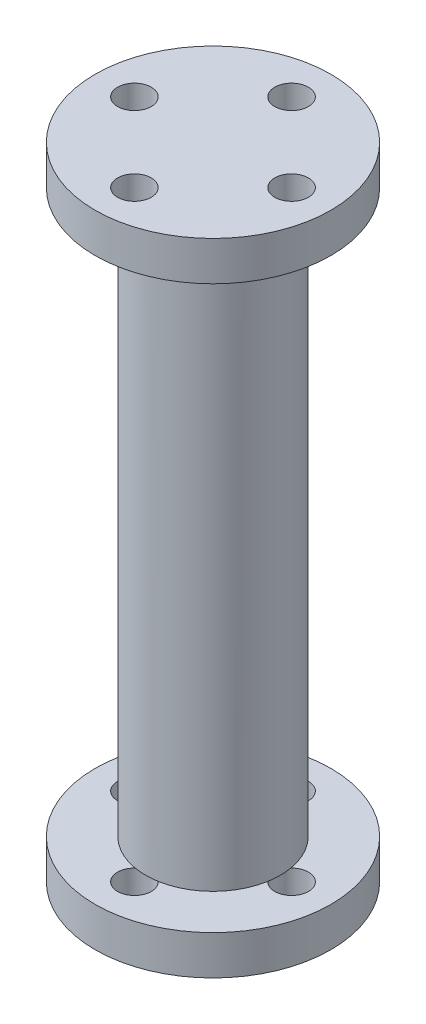
ISO-10303-21;
HEADER;
FILE_DESCRIPTION(('STEP AP214'),'2;1');
FILE_NAME('part.step','',(''),(''),'','','');
FILE_SCHEMA(('AUTOMOTIVE_DESIGN { 1 0 10303 214 1 1 1 1 }'));
ENDSEC;
DATA;
#1=APPLICATION_CONTEXT('core data for automotive mechanical design processes');
#2=APPLICATION_PROTOCOL_DEFINITION('international standard','automotive_design',2000,#1);
#3=PRODUCT_CONTEXT('',#1,'mechanical');
#4=PRODUCT('Part','Part','',(#3));
#5=PRODUCT_RELATED_PRODUCT_CATEGORY('part','',(#4));
#6=PRODUCT_DEFINITION_FORMATION('','',#4);
#7=PRODUCT_DEFINITION_CONTEXT('part definition',#1,'design');
#8=PRODUCT_DEFINITION('design','',#6,#7);
#9=PRODUCT_DEFINITION_SHAPE('','',#8);
#10=(LENGTH_UNIT() NAMED_UNIT(*) SI_UNIT(.MILLI.,.METRE.));
#11=(NAMED_UNIT(*) PLANE_ANGLE_UNIT() SI_UNIT($,.RADIAN.));
#12=(NAMED_UNIT(*) SI_UNIT($,.STERADIAN.) SOLID_ANGLE_UNIT());
#13=UNCERTAINTY_MEASURE_WITH_UNIT(LENGTH_MEASURE(1.E-05),#10,'distance_accuracy_value','');
#14=(GEOMETRIC_REPRESENTATION_CONTEXT(3) GLOBAL_UNCERTAINTY_ASSIGNED_CONTEXT((#13)) GLOBAL_UNIT_ASSIGNED_CONTEXT((#10,
#11,#12)) REPRESENTATION_CONTEXT('',''));
#15=CARTESIAN_POINT('',(0.,0.,0.));
#16=DIRECTION('',(0.,0.,1.));
#17=DIRECTION('',(1.,0.,0.));
#18=AXIS2_PLACEMENT_3D('',#15,#16,#17);
#19=CARTESIAN_POINT('',(16.6872945377766,-2.4978632583071,41.8615784724432));
#20=DIRECTION('',(0.,-1.,0.));
#21=DIRECTION('',(0.,0.,-1.));
#22=AXIS2_PLACEMENT_3D('',#19,#20,#21);
#23=CYLINDRICAL_SURFACE('',#22,10.5);
#24=CARTESIAN_POINT('',(16.6872945377766,-2.4978632583071,41.8615784724432));
#25=DIRECTION('',(0.,1.,0.));
#26=DIRECTION('',(0.,0.,1.));
#27=AXIS2_PLACEMENT_3D('',#24,#25,#26);
#28=CIRCLE('',#27,10.5);
#29=CARTESIAN_POINT('',(16.6872945377766,-2.4978632583071,31.3615784724432));
#30=VERTEX_POINT('',#29);
#31=EDGE_CURVE('E103',#30,#30,#28,.T.);
#32=CARTESIAN_POINT('',(16.6872945377766,-5.9978632583071,41.8615784724432));
#33=DIRECTION('',(0.,1.,0.));
#34=DIRECTION('',(0.,0.,1.));
#35=AXIS2_PLACEMENT_3D('',#32,#33,#34);
#36=CIRCLE('',#35,10.5);
#37=CARTESIAN_POINT('',(16.6872945377766,-5.9978632583071,31.3615784724432));
#38=VERTEX_POINT('',#37);
#39=EDGE_CURVE('E105',#38,#38,#36,.T.);
#40=CARTESIAN_POINT('',(16.6872945377766,-2.4978632583071,31.3615784724432));
#41=CARTESIAN_POINT('',(16.6872945377766,-2.53432159164043,31.3615784724432));
#42=CARTESIAN_POINT('',(16.6872945377766,-2.57077992497376,31.3615784724432));
#43=CARTESIAN_POINT('',(16.6872945377766,-2.64369659164043,31.3615784724432));
#44=CARTESIAN_POINT('',(16.6872945377766,-2.68015492497376,31.3615784724432));
#45=CARTESIAN_POINT('',(16.6872945377766,-2.75307159164043,31.3615784724432));
#46=CARTESIAN_POINT('',(16.6872945377766,-2.78952992497376,31.3615784724432));
#47=CARTESIAN_POINT('',(16.6872945377766,-2.86244659164043,31.3615784724432));
#48=CARTESIAN_POINT('',(16.6872945377766,-2.89890492497376,31.3615784724432));
#49=CARTESIAN_POINT('',(16.6872945377766,-2.97182159164043,31.3615784724432));
#50=CARTESIAN_POINT('',(16.6872945377766,-3.00827992497376,31.3615784724432));
#51=CARTESIAN_POINT('',(16.6872945377766,-3.08119659164043,31.3615784724432));
#52=CARTESIAN_POINT('',(16.6872945377766,-3.11765492497376,31.3615784724432));
#53=CARTESIAN_POINT('',(16.6872945377766,-3.19057159164043,31.3615784724432));
#54=CARTESIAN_POINT('',(16.6872945377766,-3.22702992497376,31.3615784724432));
#55=CARTESIAN_POINT('',(16.6872945377766,-3.29994659164043,31.3615784724432));
#56=CARTESIAN_POINT('',(16.6872945377766,-3.33640492497376,31.3615784724432));
#57=CARTESIAN_POINT('',(16.6872945377766,-3.40932159164043,31.3615784724432));
#58=CARTESIAN_POINT('',(16.6872945377766,-3.44577992497376,31.3615784724432));
#59=CARTESIAN_POINT('',(16.6872945377766,-3.51869659164043,31.3615784724432));
#60=CARTESIAN_POINT('',(16.6872945377766,-3.55515492497376,31.3615784724432));
#61=CARTESIAN_POINT('',(16.6872945377766,-3.62807159164043,31.3615784724432));
#62=CARTESIAN_POINT('',(16.6872945377766,-3.66452992497376,31.3615784724432));
#63=CARTESIAN_POINT('',(16.6872945377766,-3.73744659164043,31.3615784724432));
#64=CARTESIAN_POINT('',(16.6872945377766,-3.77390492497376,31.3615784724432));
#65=CARTESIAN_POINT('',(16.6872945377766,-3.84682159164043,31.3615784724432));
#66=CARTESIAN_POINT('',(16.6872945377766,-3.88327992497376,31.3615784724432));
#67=CARTESIAN_POINT('',(16.6872945377766,-3.95619659164043,31.3615784724432));
#68=CARTESIAN_POINT('',(16.6872945377766,-3.99265492497376,31.3615784724432));
#69=CARTESIAN_POINT('',(16.6872945377766,-4.06557159164043,31.3615784724432));
#70=CARTESIAN_POINT('',(16.6872945377766,-4.10202992497376,31.3615784724432));
#71=CARTESIAN_POINT('',(16.6872945377766,-4.17494659164043,31.3615784724432));
#72=CARTESIAN_POINT('',(16.6872945377766,-4.21140492497376,31.3615784724432));
#73=CARTESIAN_POINT('',(16.6872945377766,-4.28432159164043,31.3615784724432));
#74=CARTESIAN_POINT('',(16.6872945377766,-4.32077992497376,31.3615784724432));
#75=CARTESIAN_POINT('',(16.6872945377766,-4.39369659164043,31.3615784724432));
#76=CARTESIAN_POINT('',(16.6872945377766,-4.43015492497376,31.3615784724432));
#77=CARTESIAN_POINT('',(16.6872945377766,-4.50307159164043,31.3615784724432));
#78=CARTESIAN_POINT('',(16.6872945377766,-4.53952992497376,31.3615784724432));
#79=CARTESIAN_POINT('',(16.6872945377766,-4.61244659164043,31.3615784724432));
#80=CARTESIAN_POINT('',(16.6872945377766,-4.64890492497376,31.3615784724432));
#81=CARTESIAN_POINT('',(16.6872945377766,-4.72182159164043,31.3615784724432));
#82=CARTESIAN_POINT('',(16.6872945377766,-4.75827992497376,31.3615784724432));
#83=CARTESIAN_POINT('',(16.6872945377766,-4.83119659164043,31.3615784724432));
#84=CARTESIAN_POINT('',(16.6872945377766,-4.86765492497376,31.3615784724432));
#85=CARTESIAN_POINT('',(16.6872945377766,-4.94057159164043,31.3615784724432));
#86=CARTESIAN_POINT('',(16.6872945377766,-4.97702992497376,31.3615784724432));
#87=CARTESIAN_POINT('',(16.6872945377766,-5.04994659164043,31.3615784724432));
#88=CARTESIAN_POINT('',(16.6872945377766,-5.08640492497376,31.3615784724432));
#89=CARTESIAN_POINT('',(16.6872945377766,-5.15932159164043,31.3615784724432));
#90=CARTESIAN_POINT('',(16.6872945377766,-5.19577992497376,31.3615784724432));
#91=CARTESIAN_POINT('',(16.6872945377766,-5.26869659164043,31.3615784724432));
#92=CARTESIAN_POINT('',(16.6872945377766,-5.30515492497376,31.3615784724432));
#93=CARTESIAN_POINT('',(16.6872945377766,-5.37807159164043,31.3615784724432));
#94=CARTESIAN_POINT('',(16.6872945377766,-5.41452992497376,31.3615784724432));
#95=CARTESIAN_POINT('',(16.6872945377766,-5.48744659164043,31.3615784724432));
#96=CARTESIAN_POINT('',(16.6872945377766,-5.52390492497376,31.3615784724432));
#97=CARTESIAN_POINT('',(16.6872945377766,-5.59682159164043,31.3615784724432));
#98=CARTESIAN_POINT('',(16.6872945377766,-5.63327992497376,31.3615784724432));
#99=CARTESIAN_POINT('',(16.6872945377766,-5.70619659164043,31.3615784724432));
#100=CARTESIAN_POINT('',(16.6872945377766,-5.74265492497376,31.3615784724432));
#101=CARTESIAN_POINT('',(16.6872945377766,-5.81557159164043,31.3615784724432));
#102=CARTESIAN_POINT('',(16.6872945377766,-5.85202992497376,31.3615784724432));
#103=CARTESIAN_POINT('',(16.6872945377766,-5.92494659164043,31.3615784724432));
#104=CARTESIAN_POINT('',(16.6872945377766,-5.96140492497376,31.3615784724432));
#105=CARTESIAN_POINT('',(16.6872945377766,-5.9978632583071,31.3615784724432));
#106=B_SPLINE_CURVE_WITH_KNOTS('',3,(#40,#41,#42,#43,#44,#45,#46,#47,#48,#49,#50,#51,#52,#53,
#54,#55,#56,#57,#58,#59,#60,#61,#62,#63,#64,#65,#66,#67,#68,#69,#70,#71,#72,#73,#74,#75,#76,#77,
#78,#79,#80,#81,#82,#83,#84,#85,#86,#87,#88,#89,#90,#91,#92,#93,#94,#95,#96,#97,#98,#99,#100,
#101,#102,#103,#104,#105),.UNSPECIFIED.,.F.,.F.,(4,2,2,2,2,2,2,2,2,2,2,2,2,2,2,2,2,2,2,2,2,2,2,
2,2,2,2,2,2,2,2,2,4),(0.,0.109375,0.21875,0.328125,0.4375,0.546875,0.65625,0.765625,0.875,
0.984375,1.09375,1.203125,1.3125,1.421875,1.53125,1.640625,1.75,1.859375,1.96875,2.078125,
2.1875,2.296875,2.40625,2.515625,2.625,2.734375,2.84375,2.953125,3.0625,3.171875,3.28125,
3.390625,3.5),.UNSPECIFIED.);
#107=EDGE_CURVE('BSEAM38',#30,#38,#106,.T.);
#108=ORIENTED_EDGE('',*,*,#31,.F.);
#109=ORIENTED_EDGE('',*,*,#39,.T.);
#110=ORIENTED_EDGE('',*,*,#107,.T.);
#111=ORIENTED_EDGE('',*,*,#107,.F.);
#112=EDGE_LOOP('',(#108,#110,#109,#111));
#113=FACE_BOUND('',#112,.T.);
#114=ADVANCED_FACE('F38',(#113),#23,.T.);
#115=CARTESIAN_POINT('',(16.6872945377766,-2.4978632583071,41.8615784724432));
#116=DIRECTION('',(0.,1.,0.));
#117=DIRECTION('',(0.,0.,1.));
#118=AXIS2_PLACEMENT_3D('',#115,#116,#117);
#119=PLANE('',#118);
#120=CARTESIAN_POINT('',(16.6872945377766,-2.4978632583071,41.8615784724432));
#121=DIRECTION('',(0.,1.,0.));
#122=DIRECTION('',(0.,0.,1.));
#123=AXIS2_PLACEMENT_3D('',#120,#121,#122);
#124=CIRCLE('',#123,6.);
#125=CARTESIAN_POINT('',(17.7185348747761,-2.4978632583071,47.7722927581573));
#126=VERTEX_POINT('',#125);
#127=CARTESIAN_POINT('',(22.5980088234909,-2.4978632583071,42.8928188094417));
#128=VERTEX_POINT('',#127);
#129=EDGE_CURVE('E92',#126,#128,#124,.T.);
#130=ORIENTED_EDGE('',*,*,#129,.F.);
#131=CARTESIAN_POINT('',(16.687294537777,-2.4978632583071,48.8615784724432));
#132=DIRECTION('',(0.,1.,0.));
#133=DIRECTION('',(0.,0.,1.));
#134=AXIS2_PLACEMENT_3D('',#131,#132,#133);
#135=CIRCLE('',#134,1.50000000000043);
#136=CARTESIAN_POINT('',(15.6560542007777,-2.4978632583071,47.7722927581574));
#137=VERTEX_POINT('',#136);
#138=EDGE_CURVE('E83',#137,#126,#135,.T.);
#139=ORIENTED_EDGE('',*,*,#138,.F.);
#140=CARTESIAN_POINT('',(10.7765802520624,-2.4978632583071,42.8928188094426));
#141=VERTEX_POINT('',#140);
#142=EDGE_CURVE('E60',#141,#137,#124,.T.);
#143=ORIENTED_EDGE('',*,*,#142,.F.);
#144=CARTESIAN_POINT('',(9.68729453777677,-2.4978632583071,41.8615784724434));
#145=DIRECTION('',(0.,1.,0.));
#146=DIRECTION('',(0.,0.,1.));
#147=AXIS2_PLACEMENT_3D('',#144,#145,#146);
#148=CIRCLE('',#147,1.50000000000032);
#149=CARTESIAN_POINT('',(10.7765802520624,-2.4978632583071,40.8303381354441));
#150=VERTEX_POINT('',#149);
#151=EDGE_CURVE('E55',#150,#141,#148,.T.);
#152=ORIENTED_EDGE('',*,*,#151,.F.);
#153=CARTESIAN_POINT('',(15.6560542007779,-2.4978632583071,35.9508641867289));
#154=VERTEX_POINT('',#153);
#155=EDGE_CURVE('E46',#154,#150,#124,.T.);
#156=ORIENTED_EDGE('',*,*,#155,.F.);
#157=CARTESIAN_POINT('',(16.6872945377766,-2.4978632583071,34.8615784724432));
#158=DIRECTION('',(0.,1.,0.));
#159=DIRECTION('',(0.,0.,1.));
#160=AXIS2_PLACEMENT_3D('',#157,#158,#159);
#161=CIRCLE('',#160,1.5);
#162=CARTESIAN_POINT('',(17.7185348747752,-2.4978632583071,35.9508641867289));
#163=VERTEX_POINT('',#162);
#164=EDGE_CURVE('E124',#163,#154,#161,.T.);
#165=ORIENTED_EDGE('',*,*,#164,.F.);
#166=CARTESIAN_POINT('',(22.5980088234908,-2.4978632583071,40.8303381354444));
#167=VERTEX_POINT('',#166);
#168=EDGE_CURVE('E11',#167,#163,#124,.T.);
#169=ORIENTED_EDGE('',*,*,#168,.F.);
#170=CARTESIAN_POINT('',(23.6872945377768,-2.4978632583071,41.861578472443));
#171=DIRECTION('',(0.,1.,0.));
#172=DIRECTION('',(0.,0.,1.));
#173=AXIS2_PLACEMENT_3D('',#170,#171,#172);
#174=CIRCLE('',#173,1.50000000000015);
#175=EDGE_CURVE('E87',#128,#167,#174,.T.);
#176=ORIENTED_EDGE('',*,*,#175,.F.);
#177=EDGE_LOOP('',(#130,#139,#143,#152,#156,#165,#169,#176));
#178=FACE_BOUND('',#177,.T.);
#179=ORIENTED_EDGE('',*,*,#31,.T.);
#180=EDGE_LOOP('',(#179));
#181=FACE_BOUND('',#180,.T.);
#182=ADVANCED_FACE('F89',(#178,#181),#119,.T.);
#183=CARTESIAN_POINT('',(16.6872945377766,-5.9978632583071,41.8615784724432));
#184=DIRECTION('',(0.,1.,0.));
#185=DIRECTION('',(0.,0.,1.));
#186=AXIS2_PLACEMENT_3D('',#183,#184,#185);
#187=PLANE('',#186);
#188=CARTESIAN_POINT('',(16.6872945377766,-5.9978632583071,34.8615784724432));
#189=DIRECTION('',(0.,1.,0.));
#190=DIRECTION('',(0.,0.,1.));
#191=AXIS2_PLACEMENT_3D('',#188,#189,#190);
#192=CIRCLE('',#191,1.5);
#193=CARTESIAN_POINT('',(16.6872945377766,-5.9978632583071,36.3615784724432));
#194=VERTEX_POINT('',#193);
#195=EDGE_CURVE('E41',#194,#194,#192,.T.);
#196=ORIENTED_EDGE('',*,*,#195,.T.);
#197=EDGE_LOOP('',(#196));
#198=FACE_BOUND('',#197,.T.);
#199=CARTESIAN_POINT('',(23.6872945377768,-5.9978632583071,41.861578472443));
#200=DIRECTION('',(0.,1.,0.));
#201=DIRECTION('',(0.,0.,1.));
#202=AXIS2_PLACEMENT_3D('',#199,#200,#201);
#203=CIRCLE('',#202,1.50000000000015);
#204=CARTESIAN_POINT('',(23.6872945377768,-5.9978632583071,43.3615784724431));
#205=VERTEX_POINT('',#204);
#206=EDGE_CURVE('E138',#205,#205,#203,.T.);
#207=ORIENTED_EDGE('',*,*,#206,.T.);
#208=EDGE_LOOP('',(#207));
#209=FACE_BOUND('',#208,.T.);
#210=CARTESIAN_POINT('',(16.687294537777,-5.9978632583071,48.8615784724432));
#211=DIRECTION('',(0.,1.,0.));
#212=DIRECTION('',(0.,0.,1.));
#213=AXIS2_PLACEMENT_3D('',#210,#211,#212);
#214=CIRCLE('',#213,1.50000000000043);
#215=CARTESIAN_POINT('',(16.687294537777,-5.9978632583071,50.3615784724436));
#216=VERTEX_POINT('',#215);
#217=EDGE_CURVE('E136',#216,#216,#214,.T.);
#218=ORIENTED_EDGE('',*,*,#217,.T.);
#219=EDGE_LOOP('',(#218));
#220=FACE_BOUND('',#219,.T.);
#221=CARTESIAN_POINT('',(9.68729453777677,-5.9978632583071,41.8615784724434));
#222=DIRECTION('',(0.,1.,0.));
#223=DIRECTION('',(0.,0.,1.));
#224=AXIS2_PLACEMENT_3D('',#221,#222,#223);
#225=CIRCLE('',#224,1.50000000000032);
#226=CARTESIAN_POINT('',(9.68729453777677,-5.9978632583071,43.3615784724437));
#227=VERTEX_POINT('',#226);
#228=EDGE_CURVE('E127',#227,#227,#225,.T.);
#229=ORIENTED_EDGE('',*,*,#228,.T.);
#230=EDGE_LOOP('',(#229));
#231=FACE_BOUND('',#230,.T.);
#232=ORIENTED_EDGE('',*,*,#39,.F.);
#233=EDGE_LOOP('',(#232));
#234=FACE_BOUND('',#233,.T.);
#235=ADVANCED_FACE('F145',(#198,#209,#220,#231,#234),#187,.F.);
#236=CARTESIAN_POINT('',(9.68729453777677,-12.6978632583071,41.8615784724434));
#237=DIRECTION('',(0.,1.,0.));
#238=DIRECTION('',(0.,0.,1.));
#239=AXIS2_PLACEMENT_3D('',#236,#237,#238);
#240=CYLINDRICAL_SURFACE('',#239,1.50000000000032);
#241=EDGE_CURVE('E93',#141,#150,#148,.T.);
#242=ORIENTED_EDGE('',*,*,#241,.T.);
#243=ORIENTED_EDGE('',*,*,#151,.T.);
#244=EDGE_LOOP('',(#242,#243));
#245=FACE_BOUND('',#244,.T.);
#246=ORIENTED_EDGE('',*,*,#228,.F.);
#247=EDGE_LOOP('',(#246));
#248=FACE_BOUND('',#247,.T.);
#249=ADVANCED_FACE('F175',(#245,#248),#240,.F.);
#250=CARTESIAN_POINT('',(16.687294537777,-12.6978632583071,48.8615784724432));
#251=DIRECTION('',(0.,1.,0.));
#252=DIRECTION('',(0.,0.,1.));
#253=AXIS2_PLACEMENT_3D('',#250,#251,#252);
#254=CYLINDRICAL_SURFACE('',#253,1.50000000000043);
#255=EDGE_CURVE('E80',#126,#137,#135,.T.);
#256=ORIENTED_EDGE('',*,*,#255,.T.);
#257=ORIENTED_EDGE('',*,*,#138,.T.);
#258=EDGE_LOOP('',(#256,#257));
#259=FACE_BOUND('',#258,.T.);
#260=ORIENTED_EDGE('',*,*,#217,.F.);
#261=EDGE_LOOP('',(#260));
#262=FACE_BOUND('',#261,.T.);
#263=ADVANCED_FACE('F81',(#259,#262),#254,.F.);
#264=CARTESIAN_POINT('',(23.6872945377768,-12.6978632583071,41.861578472443));
#265=DIRECTION('',(0.,1.,0.));
#266=DIRECTION('',(0.,0.,1.));
#267=AXIS2_PLACEMENT_3D('',#264,#265,#266);
#268=CYLINDRICAL_SURFACE('',#267,1.50000000000015);
#269=EDGE_CURVE('E125',#167,#128,#174,.T.);
#270=ORIENTED_EDGE('',*,*,#269,.T.);
#271=ORIENTED_EDGE('',*,*,#175,.T.);
#272=EDGE_LOOP('',(#270,#271));
#273=FACE_BOUND('',#272,.T.);
#274=ORIENTED_EDGE('',*,*,#206,.F.);
#275=EDGE_LOOP('',(#274));
#276=FACE_BOUND('',#275,.T.);
#277=ADVANCED_FACE('F149',(#273,#276),#268,.F.);
#278=CARTESIAN_POINT('',(16.6872945377766,-12.6978632583071,34.8615784724432));
#279=DIRECTION('',(0.,1.,0.));
#280=DIRECTION('',(0.,0.,1.));
#281=AXIS2_PLACEMENT_3D('',#278,#279,#280);
#282=CYLINDRICAL_SURFACE('',#281,1.5);
#283=ORIENTED_EDGE('',*,*,#164,.T.);
#284=EDGE_CURVE('E120',#154,#163,#161,.T.);
#285=ORIENTED_EDGE('',*,*,#284,.T.);
#286=EDGE_LOOP('',(#283,#285));
#287=FACE_BOUND('',#286,.T.);
#288=ORIENTED_EDGE('',*,*,#195,.F.);
#289=EDGE_LOOP('',(#288));
#290=FACE_BOUND('',#289,.T.);
#291=ADVANCED_FACE('F147',(#287,#290),#282,.F.);
#292=CARTESIAN_POINT('',(16.6872945377766,-2.4978632583071,41.8615784724432));
#293=DIRECTION('',(0.,1.,0.));
#294=DIRECTION('',(0.,0.,1.));
#295=AXIS2_PLACEMENT_3D('',#292,#293,#294);
#296=PLANE('',#295);
#297=ORIENTED_EDGE('',*,*,#284,.F.);
#298=EDGE_CURVE('E113',#163,#154,#124,.T.);
#299=ORIENTED_EDGE('',*,*,#298,.F.);
#300=EDGE_LOOP('',(#297,#299));
#301=FACE_BOUND('',#300,.T.);
#302=ADVANCED_FACE('F119',(#301),#296,.F.);
#303=ORIENTED_EDGE('',*,*,#269,.F.);
#304=EDGE_CURVE('E48',#128,#167,#124,.T.);
#305=ORIENTED_EDGE('',*,*,#304,.F.);
#306=EDGE_LOOP('',(#303,#305));
#307=FACE_BOUND('',#306,.T.);
#308=ADVANCED_FACE('F155',(#307),#296,.F.);
#309=ORIENTED_EDGE('',*,*,#255,.F.);
#310=EDGE_CURVE('E94',#137,#126,#124,.T.);
#311=ORIENTED_EDGE('',*,*,#310,.F.);
#312=EDGE_LOOP('',(#309,#311));
#313=FACE_BOUND('',#312,.T.);
#314=ADVANCED_FACE('F95',(#313),#296,.F.);
#315=CARTESIAN_POINT('',(16.6872945377766,62.5839514016591,41.8615784724432));
#316=DIRECTION('',(0.,-1.,0.));
#317=DIRECTION('',(0.,0.,-1.));
#318=AXIS2_PLACEMENT_3D('',#315,#316,#317);
#319=CYLINDRICAL_SURFACE('',#318,4.07389408083162);
#320=CARTESIAN_POINT('',(16.6872945377766,47.5021367416929,41.8615784724432));
#321=DIRECTION('',(0.,1.,0.));
#322=DIRECTION('',(0.,0.,1.));
#323=AXIS2_PLACEMENT_3D('',#320,#321,#322);
#324=CIRCLE('',#323,4.07389408083162);
#325=CARTESIAN_POINT('',(16.6872945377766,47.5021367416929,45.9354725532748));
#326=VERTEX_POINT('',#325);
#327=EDGE_CURVE('E112',#326,#326,#324,.T.);
#328=ORIENTED_EDGE('',*,*,#327,.T.);
#329=EDGE_LOOP('',(#328));
#330=FACE_BOUND('',#329,.T.);
#331=CARTESIAN_POINT('',(16.6872945377766,47.5612388800921,41.8615784724432));
#332=DIRECTION('',(0.,1.,0.));
#333=DIRECTION('',(0.,0.,1.));
#334=AXIS2_PLACEMENT_3D('',#331,#332,#333);
#335=CIRCLE('',#334,4.07389408083162);
#336=CARTESIAN_POINT('',(16.6872945377766,47.5612388800921,45.9354725532748));
#337=VERTEX_POINT('',#336);
#338=EDGE_CURVE('E251',#337,#337,#335,.T.);
#339=ORIENTED_EDGE('',*,*,#338,.F.);
#340=EDGE_LOOP('',(#339));
#341=FACE_BOUND('',#340,.T.);
#342=ADVANCED_FACE('F189',(#330,#341),#319,.T.);
#343=CARTESIAN_POINT('',(16.6872945377766,47.5021367416929,41.8615784724432));
#344=DIRECTION('',(0.,-1.,0.));
#345=DIRECTION('',(0.,0.,-1.));
#346=AXIS2_PLACEMENT_3D('',#343,#344,#345);
#347=CYLINDRICAL_SURFACE('',#346,6.);
#348=CARTESIAN_POINT('',(16.6872945377766,47.5021367416929,41.8615784724432));
#349=DIRECTION('',(0.,1.,0.));
#350=DIRECTION('',(0.,0.,1.));
#351=AXIS2_PLACEMENT_3D('',#348,#349,#350);
#352=CIRCLE('',#351,6.);
#353=CARTESIAN_POINT('',(16.6872945377766,47.5021367416929,47.8615784724432));
#354=VERTEX_POINT('',#353);
#355=EDGE_CURVE('E109',#354,#354,#352,.T.);
#356=ORIENTED_EDGE('',*,*,#355,.F.);
#357=EDGE_LOOP('',(#356));
#358=FACE_BOUND('',#357,.T.);
#359=ORIENTED_EDGE('',*,*,#129,.T.);
#360=ORIENTED_EDGE('',*,*,#304,.T.);
#361=ORIENTED_EDGE('',*,*,#168,.T.);
#362=ORIENTED_EDGE('',*,*,#298,.T.);
#363=ORIENTED_EDGE('',*,*,#155,.T.);
#364=EDGE_CURVE('E97',#150,#141,#124,.T.);
#365=ORIENTED_EDGE('',*,*,#364,.T.);
#366=ORIENTED_EDGE('',*,*,#142,.T.);
#367=ORIENTED_EDGE('',*,*,#310,.T.);
#368=EDGE_LOOP('',(#359,#360,#361,#362,#363,#365,#366,#367));
#369=FACE_BOUND('',#368,.T.);
#370=ADVANCED_FACE('F100',(#358,#369),#347,.T.);
#371=CARTESIAN_POINT('',(16.6872945377766,47.5021367416929,41.8615784724432));
#372=DIRECTION('',(0.,1.,0.));
#373=DIRECTION('',(0.,0.,1.));
#374=AXIS2_PLACEMENT_3D('',#371,#372,#373);
#375=PLANE('',#374);
#376=ORIENTED_EDGE('',*,*,#327,.F.);
#377=EDGE_LOOP('',(#376));
#378=FACE_BOUND('',#377,.T.);
#379=ORIENTED_EDGE('',*,*,#355,.T.);
#380=EDGE_LOOP('',(#379));
#381=FACE_BOUND('',#380,.T.);
#382=ADVANCED_FACE('F188',(#378,#381),#375,.T.);
#383=ORIENTED_EDGE('',*,*,#241,.F.);
#384=ORIENTED_EDGE('',*,*,#364,.F.);
#385=EDGE_LOOP('',(#383,#384));
#386=FACE_BOUND('',#385,.T.);
#387=ADVANCED_FACE('F157',(#386),#296,.F.);
#388=CARTESIAN_POINT('',(16.6872945377766,51.0612388800921,41.8615784724432));
#389=DIRECTION('',(0.,-1.,0.));
#390=DIRECTION('',(0.,0.,-1.));
#391=AXIS2_PLACEMENT_3D('',#388,#389,#390);
#392=CYLINDRICAL_SURFACE('',#391,10.5);
#393=CARTESIAN_POINT('',(16.6872945377766,51.0612388800921,41.8615784724432));
#394=DIRECTION('',(0.,1.,0.));
#395=DIRECTION('',(0.,0.,1.));
#396=AXIS2_PLACEMENT_3D('',#393,#394,#395);
#397=CIRCLE('',#396,10.5);
#398=CARTESIAN_POINT('',(16.6872945377766,51.0612388800921,31.3615784724432));
#399=VERTEX_POINT('',#398);
#400=EDGE_CURVE('E98',#399,#399,#397,.T.);
#401=CARTESIAN_POINT('',(16.6872945377766,47.5612388800921,41.8615784724432));
#402=DIRECTION('',(0.,1.,0.));
#403=DIRECTION('',(0.,0.,1.));
#404=AXIS2_PLACEMENT_3D('',#401,#402,#403);
#405=CIRCLE('',#404,10.5);
#406=CARTESIAN_POINT('',(16.6872945377766,47.5612388800921,31.3615784724432));
#407=VERTEX_POINT('',#406);
#408=EDGE_CURVE('E249',#407,#407,#405,.T.);
#409=CARTESIAN_POINT('',(16.6872945377766,51.0612388800921,31.3615784724432));
#410=CARTESIAN_POINT('',(16.6872945377766,51.0247805467587,31.3615784724432));
#411=CARTESIAN_POINT('',(16.6872945377766,50.9883222134254,31.3615784724432));
#412=CARTESIAN_POINT('',(16.6872945377766,50.9154055467587,31.3615784724432));
#413=CARTESIAN_POINT('',(16.6872945377766,50.8789472134254,31.3615784724432));
#414=CARTESIAN_POINT('',(16.6872945377766,50.8060305467587,31.3615784724432));
#415=CARTESIAN_POINT('',(16.6872945377766,50.7695722134254,31.3615784724432));
#416=CARTESIAN_POINT('',(16.6872945377766,50.6966555467587,31.3615784724432));
#417=CARTESIAN_POINT('',(16.6872945377766,50.6601972134254,31.3615784724432));
#418=CARTESIAN_POINT('',(16.6872945377766,50.5872805467587,31.3615784724432));
#419=CARTESIAN_POINT('',(16.6872945377766,50.5508222134254,31.3615784724432));
#420=CARTESIAN_POINT('',(16.6872945377766,50.4779055467587,31.3615784724432));
#421=CARTESIAN_POINT('',(16.6872945377766,50.4414472134254,31.3615784724432));
#422=CARTESIAN_POINT('',(16.6872945377766,50.3685305467587,31.3615784724432));
#423=CARTESIAN_POINT('',(16.6872945377766,50.3320722134254,31.3615784724432));
#424=CARTESIAN_POINT('',(16.6872945377766,50.2591555467587,31.3615784724432));
#425=CARTESIAN_POINT('',(16.6872945377766,50.2226972134254,31.3615784724432));
#426=CARTESIAN_POINT('',(16.6872945377766,50.1497805467587,31.3615784724432));
#427=CARTESIAN_POINT('',(16.6872945377766,50.1133222134254,31.3615784724432));
#428=CARTESIAN_POINT('',(16.6872945377766,50.0404055467587,31.3615784724432));
#429=CARTESIAN_POINT('',(16.6872945377766,50.0039472134254,31.3615784724432));
#430=CARTESIAN_POINT('',(16.6872945377766,49.9310305467587,31.3615784724432));
#431=CARTESIAN_POINT('',(16.6872945377766,49.8945722134254,31.3615784724432));
#432=CARTESIAN_POINT('',(16.6872945377766,49.8216555467587,31.3615784724432));
#433=CARTESIAN_POINT('',(16.6872945377766,49.7851972134254,31.3615784724432));
#434=CARTESIAN_POINT('',(16.6872945377766,49.7122805467587,31.3615784724432));
#435=CARTESIAN_POINT('',(16.6872945377766,49.6758222134254,31.3615784724432));
#436=CARTESIAN_POINT('',(16.6872945377766,49.6029055467587,31.3615784724432));
#437=CARTESIAN_POINT('',(16.6872945377766,49.5664472134254,31.3615784724432));
#438=CARTESIAN_POINT('',(16.6872945377766,49.4935305467587,31.3615784724432));
#439=CARTESIAN_POINT('',(16.6872945377766,49.4570722134254,31.3615784724432));
#440=CARTESIAN_POINT('',(16.6872945377766,49.3841555467587,31.3615784724432));
#441=CARTESIAN_POINT('',(16.6872945377766,49.3476972134254,31.3615784724432));
#442=CARTESIAN_POINT('',(16.6872945377766,49.2747805467587,31.3615784724432));
#443=CARTESIAN_POINT('',(16.6872945377766,49.2383222134254,31.3615784724432));
#444=CARTESIAN_POINT('',(16.6872945377766,49.1654055467587,31.3615784724432));
#445=CARTESIAN_POINT('',(16.6872945377766,49.1289472134254,31.3615784724432));
#446=CARTESIAN_POINT('',(16.6872945377766,49.0560305467587,31.3615784724432));
#447=CARTESIAN_POINT('',(16.6872945377766,49.0195722134254,31.3615784724432));
#448=CARTESIAN_POINT('',(16.6872945377766,48.9466555467587,31.3615784724432));
#449=CARTESIAN_POINT('',(16.6872945377766,48.9101972134254,31.3615784724432));
#450=CARTESIAN_POINT('',(16.6872945377766,48.8372805467587,31.3615784724432));
#451=CARTESIAN_POINT('',(16.6872945377766,48.8008222134254,31.3615784724432));
#452=CARTESIAN_POINT('',(16.6872945377766,48.7279055467587,31.3615784724432));
#453=CARTESIAN_POINT('',(16.6872945377766,48.6914472134254,31.3615784724432));
#454=CARTESIAN_POINT('',(16.6872945377766,48.6185305467587,31.3615784724432));
#455=CARTESIAN_POINT('',(16.6872945377766,48.5820722134254,31.3615784724432));
#456=CARTESIAN_POINT('',(16.6872945377766,48.5091555467587,31.3615784724432));
#457=CARTESIAN_POINT('',(16.6872945377766,48.4726972134254,31.3615784724432));
#458=CARTESIAN_POINT('',(16.6872945377766,48.3997805467587,31.3615784724432));
#459=CARTESIAN_POINT('',(16.6872945377766,48.3633222134254,31.3615784724432));
#460=CARTESIAN_POINT('',(16.6872945377766,48.2904055467587,31.3615784724432));
#461=CARTESIAN_POINT('',(16.6872945377766,48.2539472134254,31.3615784724432));
#462=CARTESIAN_POINT('',(16.6872945377766,48.1810305467587,31.3615784724432));
#463=CARTESIAN_POINT('',(16.6872945377766,48.1445722134254,31.3615784724432));
#464=CARTESIAN_POINT('',(16.6872945377766,48.0716555467587,31.3615784724432));
#465=CARTESIAN_POINT('',(16.6872945377766,48.0351972134254,31.3615784724432));
#466=CARTESIAN_POINT('',(16.6872945377766,47.9622805467587,31.3615784724432));
#467=CARTESIAN_POINT('',(16.6872945377766,47.9258222134254,31.3615784724432));
#468=CARTESIAN_POINT('',(16.6872945377766,47.8529055467587,31.3615784724432));
#469=CARTESIAN_POINT('',(16.6872945377766,47.8164472134254,31.3615784724432));
#470=CARTESIAN_POINT('',(16.6872945377766,47.7435305467587,31.3615784724432));
#471=CARTESIAN_POINT('',(16.6872945377766,47.7070722134254,31.3615784724432));
#472=CARTESIAN_POINT('',(16.6872945377766,47.6341555467587,31.3615784724432));
#473=CARTESIAN_POINT('',(16.6872945377766,47.5976972134254,31.3615784724432));
#474=CARTESIAN_POINT('',(16.6872945377766,47.5612388800921,31.3615784724432));
#475=B_SPLINE_CURVE_WITH_KNOTS('',3,(#409,#410,#411,#412,#413,#414,#415,#416,#417,#418,#419,
#420,#421,#422,#423,#424,#425,#426,#427,#428,#429,#430,#431,#432,#433,#434,#435,#436,#437,#438,
#439,#440,#441,#442,#443,#444,#445,#446,#447,#448,#449,#450,#451,#452,#453,#454,#455,#456,#457,
#458,#459,#460,#461,#462,#463,#464,#465,#466,#467,#468,#469,#470,#471,#472,#473,#474),
.UNSPECIFIED.,.F.,.F.,(4,2,2,2,2,2,2,2,2,2,2,2,2,2,2,2,2,2,2,2,2,2,2,2,2,2,2,2,2,2,2,2,4),(0.,
0.109375000000002,0.218750000000004,0.328125000000005,0.4375,0.546875000000002,
0.656250000000004,0.765625000000006,0.875000000000001,0.984375000000003,1.09375,1.203125,1.3125,
1.421875,1.53125,1.640625,1.75,1.859375,1.96875,2.078125,2.1875,2.296875,2.40625,2.515625,2.625,
2.734375,2.84375,2.953125,3.0625,3.171875,3.28125,3.390625,3.5),.UNSPECIFIED.);
#476=EDGE_CURVE('BSEAM193',#399,#407,#475,.T.);
#477=ORIENTED_EDGE('',*,*,#400,.F.);
#478=ORIENTED_EDGE('',*,*,#408,.T.);
#479=ORIENTED_EDGE('',*,*,#476,.T.);
#480=ORIENTED_EDGE('',*,*,#476,.F.);
#481=EDGE_LOOP('',(#477,#479,#478,#480));
#482=FACE_BOUND('',#481,.T.);
#483=ADVANCED_FACE('F193',(#482),#392,.T.);
#484=CARTESIAN_POINT('',(16.6872945377766,47.5612388800921,41.8615784724432));
#485=DIRECTION('',(0.,1.,0.));
#486=DIRECTION('',(0.,0.,1.));
#487=AXIS2_PLACEMENT_3D('',#484,#485,#486);
#488=PLANE('',#487);
#489=ORIENTED_EDGE('',*,*,#338,.T.);
#490=EDGE_LOOP('',(#489));
#491=FACE_BOUND('',#490,.T.);
#492=CARTESIAN_POINT('',(16.6872945377766,47.5612388800921,34.8615784724432));
#493=DIRECTION('',(0.,1.,0.));
#494=DIRECTION('',(0.,0.,1.));
#495=AXIS2_PLACEMENT_3D('',#492,#493,#494);
#496=CIRCLE('',#495,1.5);
#497=CARTESIAN_POINT('',(16.6872945377766,47.5612388800921,36.3615784724432));
#498=VERTEX_POINT('',#497);
#499=EDGE_CURVE('E240',#498,#498,#496,.T.);
#500=ORIENTED_EDGE('',*,*,#499,.T.);
#501=EDGE_LOOP('',(#500));
#502=FACE_BOUND('',#501,.T.);
#503=CARTESIAN_POINT('',(23.6872945377768,47.5612388800921,41.861578472443));
#504=DIRECTION('',(0.,1.,0.));
#505=DIRECTION('',(0.,0.,1.));
#506=AXIS2_PLACEMENT_3D('',#503,#504,#505);
#507=CIRCLE('',#506,1.50000000000015);
#508=CARTESIAN_POINT('',(23.6872945377768,47.5612388800921,43.3615784724431));
#509=VERTEX_POINT('',#508);
#510=EDGE_CURVE('E236',#509,#509,#507,.T.);
#511=ORIENTED_EDGE('',*,*,#510,.T.);
#512=EDGE_LOOP('',(#511));
#513=FACE_BOUND('',#512,.T.);
#514=CARTESIAN_POINT('',(16.687294537777,47.5612388800921,48.8615784724432));
#515=DIRECTION('',(0.,1.,0.));
#516=DIRECTION('',(0.,0.,1.));
#517=AXIS2_PLACEMENT_3D('',#514,#515,#516);
#518=CIRCLE('',#517,1.50000000000043);
#519=CARTESIAN_POINT('',(16.687294537777,47.5612388800921,50.3615784724436));
#520=VERTEX_POINT('',#519);
#521=EDGE_CURVE('E234',#520,#520,#518,.T.);
#522=ORIENTED_EDGE('',*,*,#521,.T.);
#523=EDGE_LOOP('',(#522));
#524=FACE_BOUND('',#523,.T.);
#525=CARTESIAN_POINT('',(9.68729453777677,47.5612388800921,41.8615784724434));
#526=DIRECTION('',(0.,1.,0.));
#527=DIRECTION('',(0.,0.,1.));
#528=AXIS2_PLACEMENT_3D('',#525,#526,#527);
#529=CIRCLE('',#528,1.50000000000032);
#530=CARTESIAN_POINT('',(9.68729453777677,47.5612388800921,43.3615784724437));
#531=VERTEX_POINT('',#530);
#532=EDGE_CURVE('E237',#531,#531,#529,.T.);
#533=ORIENTED_EDGE('',*,*,#532,.T.);
#534=EDGE_LOOP('',(#533));
#535=FACE_BOUND('',#534,.T.);
#536=ORIENTED_EDGE('',*,*,#408,.F.);
#537=EDGE_LOOP('',(#536));
#538=FACE_BOUND('',#537,.T.);
#539=ADVANCED_FACE('F207',(#491,#502,#513,#524,#535,#538),#488,.F.);
#540=CARTESIAN_POINT('',(9.68729453777677,40.8612388800921,41.8615784724434));
#541=DIRECTION('',(0.,1.,0.));
#542=DIRECTION('',(0.,0.,1.));
#543=AXIS2_PLACEMENT_3D('',#540,#541,#542);
#544=CYLINDRICAL_SURFACE('',#543,1.50000000000032);
#545=CARTESIAN_POINT('',(9.68729453777677,51.0612388800921,41.8615784724434));
#546=DIRECTION('',(0.,1.,0.));
#547=DIRECTION('',(0.,0.,1.));
#548=AXIS2_PLACEMENT_3D('',#545,#546,#547);
#549=CIRCLE('',#548,1.50000000000032);
#550=CARTESIAN_POINT('',(9.68729453777677,51.0612388800921,43.3615784724437));
#551=VERTEX_POINT('',#550);
#552=EDGE_CURVE('E275',#551,#551,#549,.T.);
#553=ORIENTED_EDGE('',*,*,#552,.T.);
#554=EDGE_LOOP('',(#553));
#555=FACE_BOUND('',#554,.T.);
#556=ORIENTED_EDGE('',*,*,#532,.F.);
#557=EDGE_LOOP('',(#556));
#558=FACE_BOUND('',#557,.T.);
#559=ADVANCED_FACE('F211',(#555,#558),#544,.F.);
#560=CARTESIAN_POINT('',(16.687294537777,40.8612388800921,48.8615784724432));
#561=DIRECTION('',(0.,1.,0.));
#562=DIRECTION('',(0.,0.,1.));
#563=AXIS2_PLACEMENT_3D('',#560,#561,#562);
#564=CYLINDRICAL_SURFACE('',#563,1.50000000000043);
#565=CARTESIAN_POINT('',(16.687294537777,51.0612388800921,48.8615784724432));
#566=DIRECTION('',(0.,1.,0.));
#567=DIRECTION('',(0.,0.,1.));
#568=AXIS2_PLACEMENT_3D('',#565,#566,#567);
#569=CIRCLE('',#568,1.50000000000043);
#570=CARTESIAN_POINT('',(16.687294537777,51.0612388800921,50.3615784724436));
#571=VERTEX_POINT('',#570);
#572=EDGE_CURVE('E231',#571,#571,#569,.T.);
#573=ORIENTED_EDGE('',*,*,#572,.T.);
#574=EDGE_LOOP('',(#573));
#575=FACE_BOUND('',#574,.T.);
#576=ORIENTED_EDGE('',*,*,#521,.F.);
#577=EDGE_LOOP('',(#576));
#578=FACE_BOUND('',#577,.T.);
#579=ADVANCED_FACE('F216',(#575,#578),#564,.F.);
#580=CARTESIAN_POINT('',(23.6872945377768,40.8612388800921,41.861578472443));
#581=DIRECTION('',(0.,1.,0.));
#582=DIRECTION('',(0.,0.,1.));
#583=AXIS2_PLACEMENT_3D('',#580,#581,#582);
#584=CYLINDRICAL_SURFACE('',#583,1.50000000000015);
#585=CARTESIAN_POINT('',(23.6872945377768,51.0612388800921,41.861578472443));
#586=DIRECTION('',(0.,1.,0.));
#587=DIRECTION('',(0.,0.,1.));
#588=AXIS2_PLACEMENT_3D('',#585,#586,#587);
#589=CIRCLE('',#588,1.50000000000015);
#590=CARTESIAN_POINT('',(23.6872945377768,51.0612388800921,43.3615784724431));
#591=VERTEX_POINT('',#590);
#592=EDGE_CURVE('E270',#591,#591,#589,.T.);
#593=ORIENTED_EDGE('',*,*,#592,.T.);
#594=EDGE_LOOP('',(#593));
#595=FACE_BOUND('',#594,.T.);
#596=ORIENTED_EDGE('',*,*,#510,.F.);
#597=EDGE_LOOP('',(#596));
#598=FACE_BOUND('',#597,.T.);
#599=ADVANCED_FACE('F213',(#595,#598),#584,.F.);
#600=CARTESIAN_POINT('',(16.6872945377766,40.8612388800921,34.8615784724432));
#601=DIRECTION('',(0.,1.,0.));
#602=DIRECTION('',(0.,0.,1.));
#603=AXIS2_PLACEMENT_3D('',#600,#601,#602);
#604=CYLINDRICAL_SURFACE('',#603,1.5);
#605=CARTESIAN_POINT('',(16.6872945377766,51.0612388800921,34.8615784724432));
#606=DIRECTION('',(0.,1.,0.));
#607=DIRECTION('',(0.,0.,1.));
#608=AXIS2_PLACEMENT_3D('',#605,#606,#607);
#609=CIRCLE('',#608,1.5);
#610=CARTESIAN_POINT('',(16.6872945377766,51.0612388800921,36.3615784724432));
#611=VERTEX_POINT('',#610);
#612=EDGE_CURVE('E243',#611,#611,#609,.T.);
#613=ORIENTED_EDGE('',*,*,#612,.T.);
#614=EDGE_LOOP('',(#613));
#615=FACE_BOUND('',#614,.T.);
#616=ORIENTED_EDGE('',*,*,#499,.F.);
#617=EDGE_LOOP('',(#616));
#618=FACE_BOUND('',#617,.T.);
#619=ADVANCED_FACE('F201',(#615,#618),#604,.F.);
#620=CARTESIAN_POINT('',(16.6872945377766,51.0612388800921,41.8615784724432));
#621=DIRECTION('',(0.,1.,0.));
#622=DIRECTION('',(0.,0.,1.));
#623=AXIS2_PLACEMENT_3D('',#620,#621,#622);
#624=PLANE('',#623);
#625=ORIENTED_EDGE('',*,*,#612,.F.);
#626=EDGE_LOOP('',(#625));
#627=FACE_BOUND('',#626,.T.);
#628=ORIENTED_EDGE('',*,*,#592,.F.);
#629=EDGE_LOOP('',(#628));
#630=FACE_BOUND('',#629,.T.);
#631=ORIENTED_EDGE('',*,*,#572,.F.);
#632=EDGE_LOOP('',(#631));
#633=FACE_BOUND('',#632,.T.);
#634=ORIENTED_EDGE('',*,*,#552,.F.);
#635=EDGE_LOOP('',(#634));
#636=FACE_BOUND('',#635,.T.);
#637=ORIENTED_EDGE('',*,*,#400,.T.);
#638=EDGE_LOOP('',(#637));
#639=FACE_BOUND('',#638,.T.);
#640=ADVANCED_FACE('F198',(#627,#630,#633,#636,#639),#624,.T.);
#641=CLOSED_SHELL('',(#114,#182,#235,#249,#263,#277,#291,#302,#308,#314,#342,#370,#382,#387,
#483,#539,#559,#579,#599,#619,#640));
#642=MANIFOLD_SOLID_BREP('B2',#641);
#643=ADVANCED_BREP_SHAPE_REPRESENTATION('',(#18,#642),#14);
#644=SHAPE_DEFINITION_REPRESENTATION(#9,#643);
ENDSEC;
END-ISO-10303-21;
